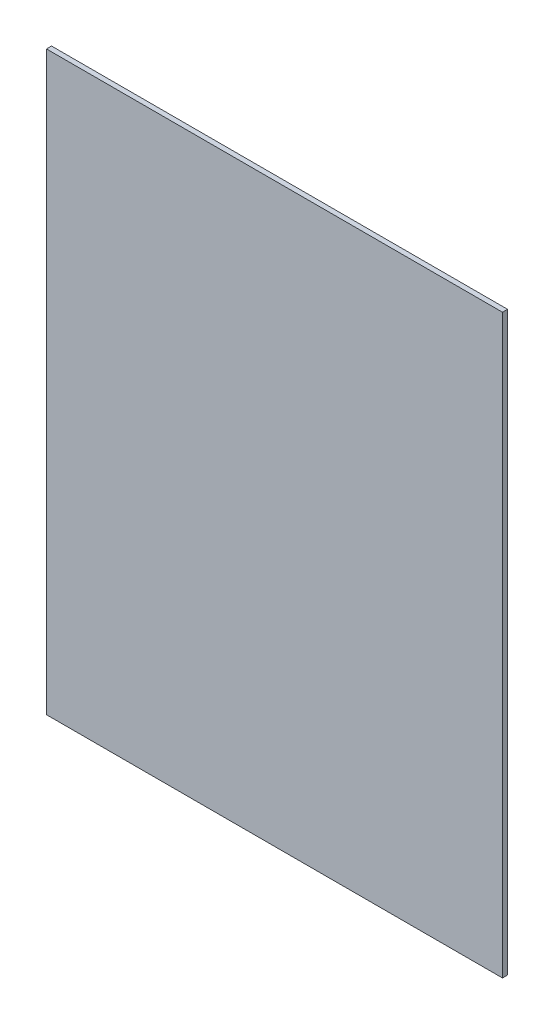
ISO-10303-21;
HEADER;
FILE_DESCRIPTION(('STEP AP214'),'2;1');
FILE_NAME('part.step','',(''),(''),'','','');
FILE_SCHEMA(('AUTOMOTIVE_DESIGN { 1 0 10303 214 1 1 1 1 }'));
ENDSEC;
DATA;
#1=APPLICATION_CONTEXT('core data for automotive mechanical design processes');
#2=APPLICATION_PROTOCOL_DEFINITION('international standard','automotive_design',2000,#1);
#3=PRODUCT_CONTEXT('',#1,'mechanical');
#4=PRODUCT('Part','Part','',(#3));
#5=PRODUCT_RELATED_PRODUCT_CATEGORY('part','',(#4));
#6=PRODUCT_DEFINITION_FORMATION('','',#4);
#7=PRODUCT_DEFINITION_CONTEXT('part definition',#1,'design');
#8=PRODUCT_DEFINITION('design','',#6,#7);
#9=PRODUCT_DEFINITION_SHAPE('','',#8);
#10=(LENGTH_UNIT() NAMED_UNIT(*) SI_UNIT(.MILLI.,.METRE.));
#11=(NAMED_UNIT(*) PLANE_ANGLE_UNIT() SI_UNIT($,.RADIAN.));
#12=(NAMED_UNIT(*) SI_UNIT($,.STERADIAN.) SOLID_ANGLE_UNIT());
#13=UNCERTAINTY_MEASURE_WITH_UNIT(LENGTH_MEASURE(1.E-05),#10,'distance_accuracy_value','');
#14=(GEOMETRIC_REPRESENTATION_CONTEXT(3) GLOBAL_UNCERTAINTY_ASSIGNED_CONTEXT((#13)) GLOBAL_UNIT_ASSIGNED_CONTEXT((#10,
#11,#12)) REPRESENTATION_CONTEXT('',''));
#15=CARTESIAN_POINT('',(0.,0.,0.));
#16=DIRECTION('',(0.,0.,1.));
#17=DIRECTION('',(1.,0.,0.));
#18=AXIS2_PLACEMENT_3D('',#15,#16,#17);
#19=CARTESIAN_POINT('',(-36.249334485739,-57.0211387052846,9.525));
#20=DIRECTION('',(0.,1.,0.));
#21=DIRECTION('',(0.,0.,1.));
#22=AXIS2_PLACEMENT_3D('',#19,#20,#21);
#23=PLANE('',#22);
#24=DIRECTION('',(1.,0.,0.));
#25=VECTOR('',#24,1.);
#26=CARTESIAN_POINT('',(-36.249334485739,-57.0211387052846,0.));
#27=LINE('',#26,#25);
#28=CARTESIAN_POINT('',(-36.249334485739,-57.0211387052846,0.));
#29=VERTEX_POINT('',#28);
#30=CARTESIAN_POINT('',(822.524665514261,-57.0211387052846,0.));
#31=VERTEX_POINT('',#30);
#32=EDGE_CURVE('E96',#29,#31,#27,.T.);
#33=ORIENTED_EDGE('',*,*,#32,.T.);
#34=DIRECTION('',(0.,0.,-1.));
#35=VECTOR('',#34,1.);
#36=CARTESIAN_POINT('',(822.524665514261,-57.0211387052846,9.525));
#37=LINE('',#36,#35);
#38=CARTESIAN_POINT('',(822.524665514261,-57.0211387052846,9.525));
#39=VERTEX_POINT('',#38);
#40=EDGE_CURVE('E11',#39,#31,#37,.T.);
#41=ORIENTED_EDGE('',*,*,#40,.F.);
#42=DIRECTION('',(1.,0.,0.));
#43=VECTOR('',#42,1.);
#44=CARTESIAN_POINT('',(-36.249334485739,-57.0211387052846,9.525));
#45=LINE('',#44,#43);
#46=CARTESIAN_POINT('',(-36.249334485739,-57.0211387052846,9.525));
#47=VERTEX_POINT('',#46);
#48=EDGE_CURVE('E73',#47,#39,#45,.T.);
#49=ORIENTED_EDGE('',*,*,#48,.F.);
#50=DIRECTION('',(0.,0.,-1.));
#51=VECTOR('',#50,1.);
#52=CARTESIAN_POINT('',(-36.249334485739,-57.0211387052846,9.525));
#53=LINE('',#52,#51);
#54=EDGE_CURVE('E92',#47,#29,#53,.T.);
#55=ORIENTED_EDGE('',*,*,#54,.T.);
#56=EDGE_LOOP('',(#33,#41,#49,#55));
#57=FACE_BOUND('',#56,.T.);
#58=ADVANCED_FACE('F34',(#57),#23,.F.);
#59=CARTESIAN_POINT('',(822.524665514261,1028.82886129472,9.525));
#60=DIRECTION('',(1.,0.,0.));
#61=DIRECTION('',(0.,1.,0.));
#62=AXIS2_PLACEMENT_3D('',#59,#60,#61);
#63=PLANE('',#62);
#64=DIRECTION('',(0.,-1.,0.));
#65=VECTOR('',#64,1.);
#66=CARTESIAN_POINT('',(822.524665514261,1028.82886129472,0.));
#67=LINE('',#66,#65);
#68=CARTESIAN_POINT('',(822.524665514261,1028.82886129472,0.));
#69=VERTEX_POINT('',#68);
#70=EDGE_CURVE('E82',#69,#31,#67,.T.);
#71=ORIENTED_EDGE('',*,*,#70,.F.);
#72=DIRECTION('',(0.,0.,-1.));
#73=VECTOR('',#72,1.);
#74=CARTESIAN_POINT('',(822.524665514261,1028.82886129472,9.525));
#75=LINE('',#74,#73);
#76=CARTESIAN_POINT('',(822.524665514261,1028.82886129472,9.525));
#77=VERTEX_POINT('',#76);
#78=EDGE_CURVE('E42',#77,#69,#75,.T.);
#79=ORIENTED_EDGE('',*,*,#78,.F.);
#80=DIRECTION('',(0.,-1.,0.));
#81=VECTOR('',#80,1.);
#82=CARTESIAN_POINT('',(822.524665514261,1028.82886129472,9.525));
#83=LINE('',#82,#81);
#84=EDGE_CURVE('E80',#77,#39,#83,.T.);
#85=ORIENTED_EDGE('',*,*,#84,.T.);
#86=ORIENTED_EDGE('',*,*,#40,.T.);
#87=EDGE_LOOP('',(#71,#79,#85,#86));
#88=FACE_BOUND('',#87,.T.);
#89=ADVANCED_FACE('F79',(#88),#63,.T.);
#90=CARTESIAN_POINT('',(-36.2493344857392,1028.82886129472,9.525));
#91=DIRECTION('',(0.,1.,0.));
#92=DIRECTION('',(0.,0.,1.));
#93=AXIS2_PLACEMENT_3D('',#90,#91,#92);
#94=PLANE('',#93);
#95=DIRECTION('',(1.,0.,0.));
#96=VECTOR('',#95,1.);
#97=CARTESIAN_POINT('',(-36.2493344857392,1028.82886129472,0.));
#98=LINE('',#97,#96);
#99=CARTESIAN_POINT('',(-36.2493344857392,1028.82886129472,0.));
#100=VERTEX_POINT('',#99);
#101=EDGE_CURVE('E100',#100,#69,#98,.T.);
#102=ORIENTED_EDGE('',*,*,#101,.F.);
#103=DIRECTION('',(0.,0.,-1.));
#104=VECTOR('',#103,1.);
#105=CARTESIAN_POINT('',(-36.2493344857392,1028.82886129472,9.525));
#106=LINE('',#105,#104);
#107=CARTESIAN_POINT('',(-36.2493344857392,1028.82886129472,9.525));
#108=VERTEX_POINT('',#107);
#109=EDGE_CURVE('E65',#108,#100,#106,.T.);
#110=ORIENTED_EDGE('',*,*,#109,.F.);
#111=DIRECTION('',(1.,0.,0.));
#112=VECTOR('',#111,1.);
#113=CARTESIAN_POINT('',(-36.2493344857392,1028.82886129472,9.525));
#114=LINE('',#113,#112);
#115=EDGE_CURVE('E88',#108,#77,#114,.T.);
#116=ORIENTED_EDGE('',*,*,#115,.T.);
#117=ORIENTED_EDGE('',*,*,#78,.T.);
#118=EDGE_LOOP('',(#102,#110,#116,#117));
#119=FACE_BOUND('',#118,.T.);
#120=ADVANCED_FACE('F90',(#119),#94,.T.);
#121=CARTESIAN_POINT('',(-36.2493344857392,1028.82886129472,9.525));
#122=DIRECTION('',(1.,0.,0.));
#123=DIRECTION('',(0.,1.,0.));
#124=AXIS2_PLACEMENT_3D('',#121,#122,#123);
#125=PLANE('',#124);
#126=DIRECTION('',(0.,-1.,0.));
#127=VECTOR('',#126,1.);
#128=CARTESIAN_POINT('',(-36.2493344857392,1028.82886129472,0.));
#129=LINE('',#128,#127);
#130=EDGE_CURVE('E68',#100,#29,#129,.T.);
#131=ORIENTED_EDGE('',*,*,#130,.T.);
#132=ORIENTED_EDGE('',*,*,#54,.F.);
#133=DIRECTION('',(0.,-1.,0.));
#134=VECTOR('',#133,1.);
#135=CARTESIAN_POINT('',(-36.2493344857392,1028.82886129472,9.525));
#136=LINE('',#135,#134);
#137=EDGE_CURVE('E50',#108,#47,#136,.T.);
#138=ORIENTED_EDGE('',*,*,#137,.F.);
#139=ORIENTED_EDGE('',*,*,#109,.T.);
#140=EDGE_LOOP('',(#131,#132,#138,#139));
#141=FACE_BOUND('',#140,.T.);
#142=ADVANCED_FACE('F113',(#141),#125,.F.);
#143=CARTESIAN_POINT('',(0.,0.,9.525));
#144=DIRECTION('',(0.,0.,-1.));
#145=DIRECTION('',(-1.,0.,0.));
#146=AXIS2_PLACEMENT_3D('',#143,#144,#145);
#147=PLANE('',#146);
#148=ORIENTED_EDGE('',*,*,#48,.T.);
#149=ORIENTED_EDGE('',*,*,#84,.F.);
#150=ORIENTED_EDGE('',*,*,#115,.F.);
#151=ORIENTED_EDGE('',*,*,#137,.T.);
#152=EDGE_LOOP('',(#148,#149,#150,#151));
#153=FACE_BOUND('',#152,.T.);
#154=ADVANCED_FACE('F87',(#153),#147,.F.);
#155=CARTESIAN_POINT('',(0.,0.,0.));
#156=DIRECTION('',(0.,0.,-1.));
#157=DIRECTION('',(-1.,0.,0.));
#158=AXIS2_PLACEMENT_3D('',#155,#156,#157);
#159=PLANE('',#158);
#160=ORIENTED_EDGE('',*,*,#32,.F.);
#161=ORIENTED_EDGE('',*,*,#130,.F.);
#162=ORIENTED_EDGE('',*,*,#101,.T.);
#163=ORIENTED_EDGE('',*,*,#70,.T.);
#164=EDGE_LOOP('',(#160,#161,#162,#163));
#165=FACE_BOUND('',#164,.T.);
#166=ADVANCED_FACE('F107',(#165),#159,.T.);
#167=CLOSED_SHELL('',(#58,#89,#120,#142,#154,#166));
#168=MANIFOLD_SOLID_BREP('B2',#167);
#169=ADVANCED_BREP_SHAPE_REPRESENTATION('',(#18,#168),#14);
#170=SHAPE_DEFINITION_REPRESENTATION(#9,#169);
ENDSEC;
END-ISO-10303-21;
